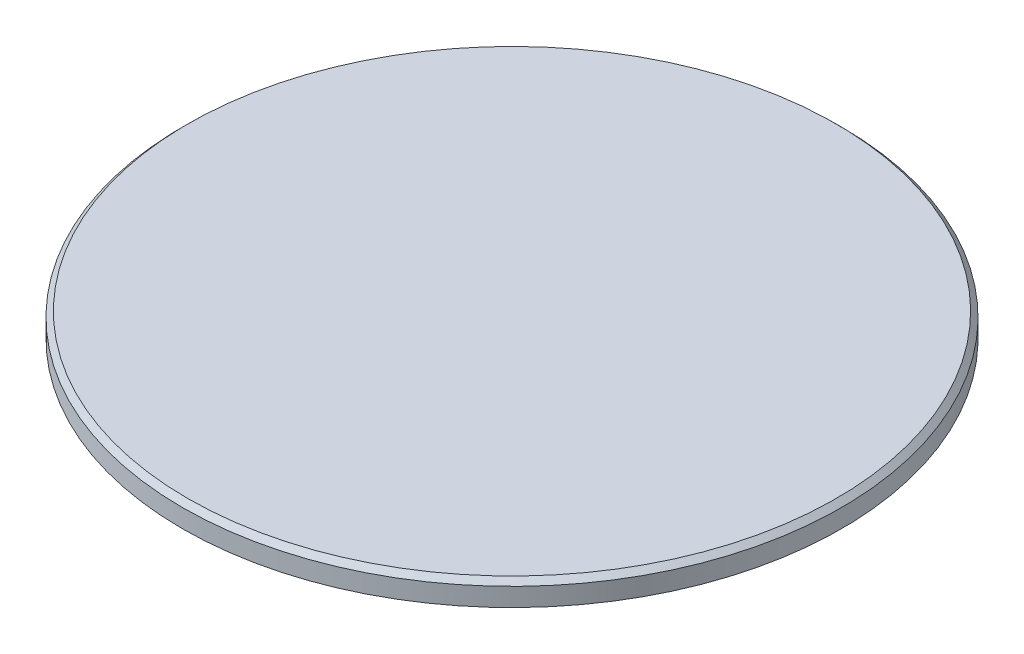
ISO-10303-21;
HEADER;
FILE_DESCRIPTION(('STEP AP214'),'2;1');
FILE_NAME('part.step','',(''),(''),'','','');
FILE_SCHEMA(('AUTOMOTIVE_DESIGN { 1 0 10303 214 1 1 1 1 }'));
ENDSEC;
DATA;
#1=APPLICATION_CONTEXT('core data for automotive mechanical design processes');
#2=APPLICATION_PROTOCOL_DEFINITION('international standard','automotive_design',2000,#1);
#3=PRODUCT_CONTEXT('',#1,'mechanical');
#4=PRODUCT('Part','Part','',(#3));
#5=PRODUCT_RELATED_PRODUCT_CATEGORY('part','',(#4));
#6=PRODUCT_DEFINITION_FORMATION('','',#4);
#7=PRODUCT_DEFINITION_CONTEXT('part definition',#1,'design');
#8=PRODUCT_DEFINITION('design','',#6,#7);
#9=PRODUCT_DEFINITION_SHAPE('','',#8);
#10=(LENGTH_UNIT() NAMED_UNIT(*) SI_UNIT(.MILLI.,.METRE.));
#11=(NAMED_UNIT(*) PLANE_ANGLE_UNIT() SI_UNIT($,.RADIAN.));
#12=(NAMED_UNIT(*) SI_UNIT($,.STERADIAN.) SOLID_ANGLE_UNIT());
#13=UNCERTAINTY_MEASURE_WITH_UNIT(LENGTH_MEASURE(1.E-05),#10,'distance_accuracy_value','');
#14=(GEOMETRIC_REPRESENTATION_CONTEXT(3) GLOBAL_UNCERTAINTY_ASSIGNED_CONTEXT((#13)) GLOBAL_UNIT_ASSIGNED_CONTEXT((#10,
#11,#12)) REPRESENTATION_CONTEXT('',''));
#15=CARTESIAN_POINT('',(0.,0.,0.));
#16=DIRECTION('',(0.,0.,1.));
#17=DIRECTION('',(1.,0.,0.));
#18=AXIS2_PLACEMENT_3D('',#15,#16,#17);
#19=CARTESIAN_POINT('',(0.,0.9,0.));
#20=DIRECTION('',(0.,-1.,0.));
#21=DIRECTION('',(0.,0.,-1.));
#22=AXIS2_PLACEMENT_3D('',#19,#20,#21);
#23=CYLINDRICAL_SURFACE('',#22,12.55);
#24=CARTESIAN_POINT('',(0.,0.699999999999999,0.));
#25=DIRECTION('',(0.,1.,0.));
#26=DIRECTION('',(0.,0.,1.));
#27=AXIS2_PLACEMENT_3D('',#24,#25,#26);
#28=CIRCLE('',#27,12.55);
#29=CARTESIAN_POINT('',(0.,0.699999999999999,12.55));
#30=VERTEX_POINT('',#29);
#31=EDGE_CURVE('E10',#30,#30,#28,.F.);
#32=ORIENTED_EDGE('',*,*,#31,.T.);
#33=EDGE_LOOP('',(#32));
#34=FACE_BOUND('',#33,.T.);
#35=CARTESIAN_POINT('',(0.,0.,0.));
#36=DIRECTION('',(0.,1.,0.));
#37=DIRECTION('',(0.,0.,1.));
#38=AXIS2_PLACEMENT_3D('',#35,#36,#37);
#39=CIRCLE('',#38,12.55);
#40=CARTESIAN_POINT('',(0.,0.,12.55));
#41=VERTEX_POINT('',#40);
#42=EDGE_CURVE('E42',#41,#41,#39,.T.);
#43=ORIENTED_EDGE('',*,*,#42,.T.);
#44=EDGE_LOOP('',(#43));
#45=FACE_BOUND('',#44,.T.);
#46=ADVANCED_FACE('F31',(#34,#45),#23,.T.);
#47=CARTESIAN_POINT('',(0.,0.9,0.));
#48=DIRECTION('',(0.,1.,0.));
#49=DIRECTION('',(0.,0.,1.));
#50=AXIS2_PLACEMENT_3D('',#47,#48,#49);
#51=PLANE('',#50);
#52=CARTESIAN_POINT('',(0.,0.9,0.));
#53=DIRECTION('',(0.,1.,0.));
#54=DIRECTION('',(0.,0.,1.));
#55=AXIS2_PLACEMENT_3D('',#52,#53,#54);
#56=CIRCLE('',#55,12.35);
#57=CARTESIAN_POINT('',(0.,0.9,12.35));
#58=VERTEX_POINT('',#57);
#59=EDGE_CURVE('E38',#58,#58,#56,.T.);
#60=ORIENTED_EDGE('',*,*,#59,.T.);
#61=EDGE_LOOP('',(#60));
#62=FACE_BOUND('',#61,.T.);
#63=ADVANCED_FACE('F52',(#62),#51,.T.);
#64=CARTESIAN_POINT('',(0.,0.,0.));
#65=DIRECTION('',(0.,1.,0.));
#66=DIRECTION('',(0.,0.,1.));
#67=AXIS2_PLACEMENT_3D('',#64,#65,#66);
#68=PLANE('',#67);
#69=ORIENTED_EDGE('',*,*,#42,.F.);
#70=EDGE_LOOP('',(#69));
#71=FACE_BOUND('',#70,.T.);
#72=ADVANCED_FACE('F50',(#71),#68,.F.);
#73=CARTESIAN_POINT('',(0.,0.9,0.));
#74=DIRECTION('',(0.,-1.,0.));
#75=DIRECTION('',(0.,0.,-1.));
#76=AXIS2_PLACEMENT_3D('',#73,#74,#75);
#77=CONICAL_SURFACE('',#76,12.35,0.785398163397444);
#78=ORIENTED_EDGE('',*,*,#31,.F.);
#79=EDGE_LOOP('',(#78));
#80=FACE_BOUND('',#79,.T.);
#81=ORIENTED_EDGE('',*,*,#59,.F.);
#82=EDGE_LOOP('',(#81));
#83=FACE_BOUND('',#82,.T.);
#84=ADVANCED_FACE('F33',(#80,#83),#77,.T.);
#85=CLOSED_SHELL('',(#46,#63,#72,#84));
#86=MANIFOLD_SOLID_BREP('B2',#85);
#87=ADVANCED_BREP_SHAPE_REPRESENTATION('',(#18,#86),#14);
#88=SHAPE_DEFINITION_REPRESENTATION(#9,#87);
ENDSEC;
END-ISO-10303-21;
